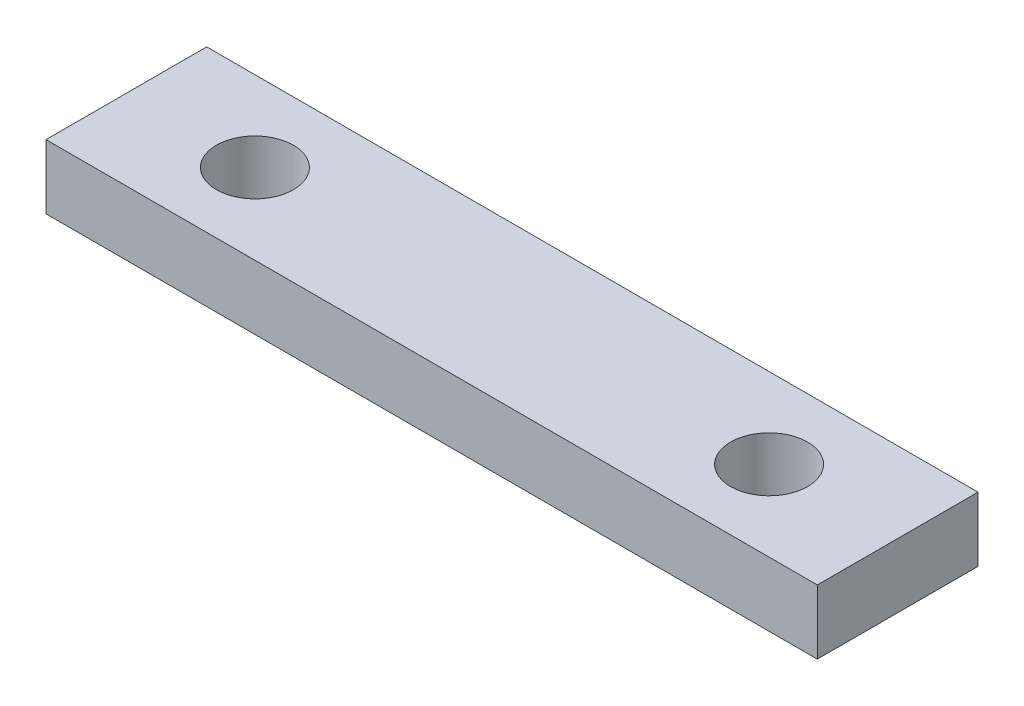
ISO-10303-21;
HEADER;
FILE_DESCRIPTION(('STEP AP214'),'2;1');
FILE_NAME('part.step','',(''),(''),'','','');
FILE_SCHEMA(('AUTOMOTIVE_DESIGN { 1 0 10303 214 1 1 1 1 }'));
ENDSEC;
DATA;
#1=APPLICATION_CONTEXT('core data for automotive mechanical design processes');
#2=APPLICATION_PROTOCOL_DEFINITION('international standard','automotive_design',2000,#1);
#3=PRODUCT_CONTEXT('',#1,'mechanical');
#4=PRODUCT('Part','Part','',(#3));
#5=PRODUCT_RELATED_PRODUCT_CATEGORY('part','',(#4));
#6=PRODUCT_DEFINITION_FORMATION('','',#4);
#7=PRODUCT_DEFINITION_CONTEXT('part definition',#1,'design');
#8=PRODUCT_DEFINITION('design','',#6,#7);
#9=PRODUCT_DEFINITION_SHAPE('','',#8);
#10=(LENGTH_UNIT() NAMED_UNIT(*) SI_UNIT(.MILLI.,.METRE.));
#11=(NAMED_UNIT(*) PLANE_ANGLE_UNIT() SI_UNIT($,.RADIAN.));
#12=(NAMED_UNIT(*) SI_UNIT($,.STERADIAN.) SOLID_ANGLE_UNIT());
#13=UNCERTAINTY_MEASURE_WITH_UNIT(LENGTH_MEASURE(1.E-05),#10,'distance_accuracy_value','');
#14=(GEOMETRIC_REPRESENTATION_CONTEXT(3) GLOBAL_UNCERTAINTY_ASSIGNED_CONTEXT((#13)) GLOBAL_UNIT_ASSIGNED_CONTEXT((#10,
#11,#12)) REPRESENTATION_CONTEXT('',''));
#15=CARTESIAN_POINT('',(0.,0.,0.));
#16=DIRECTION('',(0.,0.,1.));
#17=DIRECTION('',(1.,0.,0.));
#18=AXIS2_PLACEMENT_3D('',#15,#16,#17);
#19=CARTESIAN_POINT('',(0.,10.,0.));
#20=DIRECTION('',(0.,1.,0.));
#21=DIRECTION('',(0.,0.,1.));
#22=AXIS2_PLACEMENT_3D('',#19,#20,#21);
#23=PLANE('',#22);
#24=CARTESIAN_POINT('',(40.,10.,0.));
#25=DIRECTION('',(0.,1.,0.));
#26=DIRECTION('',(0.,0.,1.));
#27=AXIS2_PLACEMENT_3D('',#24,#25,#26);
#28=CIRCLE('',#27,5.99999999999999);
#29=CARTESIAN_POINT('',(40.,10.,5.99999999999999));
#30=VERTEX_POINT('',#29);
#31=EDGE_CURVE('E102',#30,#30,#28,.T.);
#32=ORIENTED_EDGE('',*,*,#31,.F.);
#33=EDGE_LOOP('',(#32));
#34=FACE_BOUND('',#33,.T.);
#35=DIRECTION('',(0.,0.,1.));
#36=VECTOR('',#35,1.);
#37=CARTESIAN_POINT('',(-60.,10.,-12.5));
#38=LINE('',#37,#36);
#39=CARTESIAN_POINT('',(-60.,10.,-12.5));
#40=VERTEX_POINT('',#39);
#41=CARTESIAN_POINT('',(-60.,10.,12.5));
#42=VERTEX_POINT('',#41);
#43=EDGE_CURVE('E87',#40,#42,#38,.T.);
#44=ORIENTED_EDGE('',*,*,#43,.T.);
#45=DIRECTION('',(1.,0.,0.));
#46=VECTOR('',#45,1.);
#47=CARTESIAN_POINT('',(-60.,10.,12.5));
#48=LINE('',#47,#46);
#49=CARTESIAN_POINT('',(60.,10.,12.5));
#50=VERTEX_POINT('',#49);
#51=EDGE_CURVE('E82',#42,#50,#48,.T.);
#52=ORIENTED_EDGE('',*,*,#51,.T.);
#53=DIRECTION('',(0.,0.,-1.));
#54=VECTOR('',#53,1.);
#55=CARTESIAN_POINT('',(60.,10.,-12.5));
#56=LINE('',#55,#54);
#57=CARTESIAN_POINT('',(60.,10.,-12.5));
#58=VERTEX_POINT('',#57);
#59=EDGE_CURVE('E85',#50,#58,#56,.T.);
#60=ORIENTED_EDGE('',*,*,#59,.T.);
#61=DIRECTION('',(-1.,0.,0.));
#62=VECTOR('',#61,1.);
#63=CARTESIAN_POINT('',(-60.,10.,-12.5));
#64=LINE('',#63,#62);
#65=EDGE_CURVE('E52',#58,#40,#64,.T.);
#66=ORIENTED_EDGE('',*,*,#65,.T.);
#67=EDGE_LOOP('',(#44,#52,#60,#66));
#68=FACE_BOUND('',#67,.T.);
#69=CARTESIAN_POINT('',(-40.,10.,0.));
#70=DIRECTION('',(0.,1.,0.));
#71=DIRECTION('',(0.,0.,1.));
#72=AXIS2_PLACEMENT_3D('',#69,#70,#71);
#73=CIRCLE('',#72,5.99999999999999);
#74=CARTESIAN_POINT('',(-40.,10.,5.99999999999999));
#75=VERTEX_POINT('',#74);
#76=EDGE_CURVE('E117',#75,#75,#73,.T.);
#77=ORIENTED_EDGE('',*,*,#76,.F.);
#78=EDGE_LOOP('',(#77));
#79=FACE_BOUND('',#78,.T.);
#80=ADVANCED_FACE('F35',(#34,#68,#79),#23,.T.);
#81=CARTESIAN_POINT('',(0.,0.,0.));
#82=DIRECTION('',(0.,1.,0.));
#83=DIRECTION('',(0.,0.,1.));
#84=AXIS2_PLACEMENT_3D('',#81,#82,#83);
#85=PLANE('',#84);
#86=DIRECTION('',(0.,0.,1.));
#87=VECTOR('',#86,1.);
#88=CARTESIAN_POINT('',(-60.,0.,-12.5));
#89=LINE('',#88,#87);
#90=CARTESIAN_POINT('',(-60.,0.,-12.5));
#91=VERTEX_POINT('',#90);
#92=CARTESIAN_POINT('',(-60.,0.,12.5));
#93=VERTEX_POINT('',#92);
#94=EDGE_CURVE('E99',#91,#93,#89,.T.);
#95=ORIENTED_EDGE('',*,*,#94,.F.);
#96=DIRECTION('',(-1.,0.,0.));
#97=VECTOR('',#96,1.);
#98=CARTESIAN_POINT('',(-60.,0.,-12.5));
#99=LINE('',#98,#97);
#100=CARTESIAN_POINT('',(60.,0.,-12.5));
#101=VERTEX_POINT('',#100);
#102=EDGE_CURVE('E75',#101,#91,#99,.T.);
#103=ORIENTED_EDGE('',*,*,#102,.F.);
#104=DIRECTION('',(0.,0.,-1.));
#105=VECTOR('',#104,1.);
#106=CARTESIAN_POINT('',(60.,0.,-12.5));
#107=LINE('',#106,#105);
#108=CARTESIAN_POINT('',(60.,0.,12.5));
#109=VERTEX_POINT('',#108);
#110=EDGE_CURVE('E69',#109,#101,#107,.T.);
#111=ORIENTED_EDGE('',*,*,#110,.F.);
#112=DIRECTION('',(1.,0.,0.));
#113=VECTOR('',#112,1.);
#114=CARTESIAN_POINT('',(-60.,0.,12.5));
#115=LINE('',#114,#113);
#116=EDGE_CURVE('E91',#93,#109,#115,.T.);
#117=ORIENTED_EDGE('',*,*,#116,.F.);
#118=EDGE_LOOP('',(#95,#103,#111,#117));
#119=FACE_BOUND('',#118,.T.);
#120=CARTESIAN_POINT('',(40.,0.,0.));
#121=DIRECTION('',(0.,1.,0.));
#122=DIRECTION('',(0.,0.,1.));
#123=AXIS2_PLACEMENT_3D('',#120,#121,#122);
#124=CIRCLE('',#123,5.99999999999999);
#125=CARTESIAN_POINT('',(40.,0.,5.99999999999999));
#126=VERTEX_POINT('',#125);
#127=EDGE_CURVE('E114',#126,#126,#124,.T.);
#128=ORIENTED_EDGE('',*,*,#127,.T.);
#129=EDGE_LOOP('',(#128));
#130=FACE_BOUND('',#129,.T.);
#131=CARTESIAN_POINT('',(-40.,0.,0.));
#132=DIRECTION('',(0.,1.,0.));
#133=DIRECTION('',(0.,0.,1.));
#134=AXIS2_PLACEMENT_3D('',#131,#132,#133);
#135=CIRCLE('',#134,5.99999999999999);
#136=CARTESIAN_POINT('',(-40.,0.,5.99999999999999));
#137=VERTEX_POINT('',#136);
#138=EDGE_CURVE('E120',#137,#137,#135,.T.);
#139=ORIENTED_EDGE('',*,*,#138,.T.);
#140=EDGE_LOOP('',(#139));
#141=FACE_BOUND('',#140,.T.);
#142=ADVANCED_FACE('F110',(#119,#130,#141),#85,.F.);
#143=CARTESIAN_POINT('',(-60.,10.,-12.5));
#144=DIRECTION('',(1.,0.,0.));
#145=DIRECTION('',(0.,0.,-1.));
#146=AXIS2_PLACEMENT_3D('',#143,#144,#145);
#147=PLANE('',#146);
#148=ORIENTED_EDGE('',*,*,#94,.T.);
#149=DIRECTION('',(0.,-1.,0.));
#150=VECTOR('',#149,1.);
#151=CARTESIAN_POINT('',(-60.,10.,12.5));
#152=LINE('',#151,#150);
#153=EDGE_CURVE('E11',#42,#93,#152,.T.);
#154=ORIENTED_EDGE('',*,*,#153,.F.);
#155=ORIENTED_EDGE('',*,*,#43,.F.);
#156=DIRECTION('',(0.,-1.,0.));
#157=VECTOR('',#156,1.);
#158=CARTESIAN_POINT('',(-60.,10.,-12.5));
#159=LINE('',#158,#157);
#160=EDGE_CURVE('E95',#40,#91,#159,.T.);
#161=ORIENTED_EDGE('',*,*,#160,.T.);
#162=EDGE_LOOP('',(#148,#154,#155,#161));
#163=FACE_BOUND('',#162,.T.);
#164=ADVANCED_FACE('F37',(#163),#147,.F.);
#165=CARTESIAN_POINT('',(-60.,10.,12.5));
#166=DIRECTION('',(0.,0.,-1.));
#167=DIRECTION('',(-1.,0.,0.));
#168=AXIS2_PLACEMENT_3D('',#165,#166,#167);
#169=PLANE('',#168);
#170=ORIENTED_EDGE('',*,*,#116,.T.);
#171=DIRECTION('',(0.,-1.,0.));
#172=VECTOR('',#171,1.);
#173=CARTESIAN_POINT('',(60.,10.,12.5));
#174=LINE('',#173,#172);
#175=EDGE_CURVE('E44',#50,#109,#174,.T.);
#176=ORIENTED_EDGE('',*,*,#175,.F.);
#177=ORIENTED_EDGE('',*,*,#51,.F.);
#178=ORIENTED_EDGE('',*,*,#153,.T.);
#179=EDGE_LOOP('',(#170,#176,#177,#178));
#180=FACE_BOUND('',#179,.T.);
#181=ADVANCED_FACE('F90',(#180),#169,.F.);
#182=CARTESIAN_POINT('',(60.,10.,-12.5));
#183=DIRECTION('',(-1.,0.,0.));
#184=DIRECTION('',(0.,0.,1.));
#185=AXIS2_PLACEMENT_3D('',#182,#183,#184);
#186=PLANE('',#185);
#187=ORIENTED_EDGE('',*,*,#110,.T.);
#188=DIRECTION('',(0.,-1.,0.));
#189=VECTOR('',#188,1.);
#190=CARTESIAN_POINT('',(60.,10.,-12.5));
#191=LINE('',#190,#189);
#192=EDGE_CURVE('E92',#58,#101,#191,.T.);
#193=ORIENTED_EDGE('',*,*,#192,.F.);
#194=ORIENTED_EDGE('',*,*,#59,.F.);
#195=ORIENTED_EDGE('',*,*,#175,.T.);
#196=EDGE_LOOP('',(#187,#193,#194,#195));
#197=FACE_BOUND('',#196,.T.);
#198=ADVANCED_FACE('F93',(#197),#186,.F.);
#199=CARTESIAN_POINT('',(-60.,10.,-12.5));
#200=DIRECTION('',(0.,0.,1.));
#201=DIRECTION('',(1.,0.,0.));
#202=AXIS2_PLACEMENT_3D('',#199,#200,#201);
#203=PLANE('',#202);
#204=ORIENTED_EDGE('',*,*,#102,.T.);
#205=ORIENTED_EDGE('',*,*,#160,.F.);
#206=ORIENTED_EDGE('',*,*,#65,.F.);
#207=ORIENTED_EDGE('',*,*,#192,.T.);
#208=EDGE_LOOP('',(#204,#205,#206,#207));
#209=FACE_BOUND('',#208,.T.);
#210=ADVANCED_FACE('F107',(#209),#203,.F.);
#211=CARTESIAN_POINT('',(40.,10.,0.));
#212=DIRECTION('',(0.,-1.,0.));
#213=DIRECTION('',(0.,0.,-1.));
#214=AXIS2_PLACEMENT_3D('',#211,#212,#213);
#215=CYLINDRICAL_SURFACE('',#214,5.99999999999999);
#216=ORIENTED_EDGE('',*,*,#31,.T.);
#217=EDGE_LOOP('',(#216));
#218=FACE_BOUND('',#217,.T.);
#219=ORIENTED_EDGE('',*,*,#127,.F.);
#220=EDGE_LOOP('',(#219));
#221=FACE_BOUND('',#220,.T.);
#222=ADVANCED_FACE('F137',(#218,#221),#215,.F.);
#223=CARTESIAN_POINT('',(-40.,10.,0.));
#224=DIRECTION('',(0.,-1.,0.));
#225=DIRECTION('',(0.,0.,-1.));
#226=AXIS2_PLACEMENT_3D('',#223,#224,#225);
#227=CYLINDRICAL_SURFACE('',#226,5.99999999999999);
#228=ORIENTED_EDGE('',*,*,#76,.T.);
#229=EDGE_LOOP('',(#228));
#230=FACE_BOUND('',#229,.T.);
#231=ORIENTED_EDGE('',*,*,#138,.F.);
#232=EDGE_LOOP('',(#231));
#233=FACE_BOUND('',#232,.T.);
#234=ADVANCED_FACE('F126',(#230,#233),#227,.F.);
#235=CLOSED_SHELL('',(#80,#142,#164,#181,#198,#210,#222,#234));
#236=MANIFOLD_SOLID_BREP('B2',#235);
#237=ADVANCED_BREP_SHAPE_REPRESENTATION('',(#18,#236),#14);
#238=SHAPE_DEFINITION_REPRESENTATION(#9,#237);
ENDSEC;
END-ISO-10303-21;
